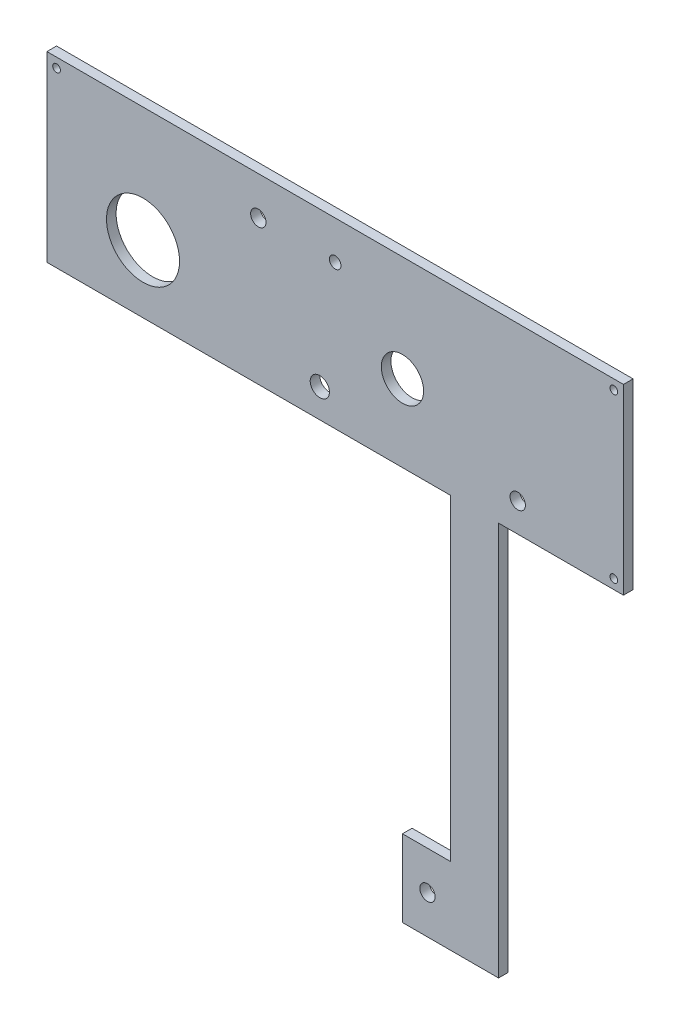
ISO-10303-21;
HEADER;
FILE_DESCRIPTION(('STEP AP214'),'2;1');
FILE_NAME('part.step','',(''),(''),'','','');
FILE_SCHEMA(('AUTOMOTIVE_DESIGN { 1 0 10303 214 1 1 1 1 }'));
ENDSEC;
DATA;
#1=APPLICATION_CONTEXT('core data for automotive mechanical design processes');
#2=APPLICATION_PROTOCOL_DEFINITION('international standard','automotive_design',2000,#1);
#3=PRODUCT_CONTEXT('',#1,'mechanical');
#4=PRODUCT('Part','Part','',(#3));
#5=PRODUCT_RELATED_PRODUCT_CATEGORY('part','',(#4));
#6=PRODUCT_DEFINITION_FORMATION('','',#4);
#7=PRODUCT_DEFINITION_CONTEXT('part definition',#1,'design');
#8=PRODUCT_DEFINITION('design','',#6,#7);
#9=PRODUCT_DEFINITION_SHAPE('','',#8);
#10=(LENGTH_UNIT() NAMED_UNIT(*) SI_UNIT(.MILLI.,.METRE.));
#11=(NAMED_UNIT(*) PLANE_ANGLE_UNIT() SI_UNIT($,.RADIAN.));
#12=(NAMED_UNIT(*) SI_UNIT($,.STERADIAN.) SOLID_ANGLE_UNIT());
#13=UNCERTAINTY_MEASURE_WITH_UNIT(LENGTH_MEASURE(1.E-05),#10,'distance_accuracy_value','');
#14=(GEOMETRIC_REPRESENTATION_CONTEXT(3) GLOBAL_UNCERTAINTY_ASSIGNED_CONTEXT((#13)) GLOBAL_UNIT_ASSIGNED_CONTEXT((#10,
#11,#12)) REPRESENTATION_CONTEXT('',''));
#15=CARTESIAN_POINT('',(0.,0.,0.));
#16=DIRECTION('',(0.,0.,1.));
#17=DIRECTION('',(1.,0.,0.));
#18=AXIS2_PLACEMENT_3D('',#15,#16,#17);
#19=CARTESIAN_POINT('',(105.426271186441,-8.28728813559318,5.));
#20=DIRECTION('',(0.,0.,-1.));
#21=DIRECTION('',(-1.,0.,0.));
#22=AXIS2_PLACEMENT_3D('',#19,#20,#21);
#23=PLANE('',#22);
#24=CARTESIAN_POINT('',(165.426271186441,81.7127118644068,5.));
#25=DIRECTION('',(0.,0.,1.));
#26=DIRECTION('',(1.,0.,0.));
#27=AXIS2_PLACEMENT_3D('',#24,#25,#26);
#28=CIRCLE('',#27,2.);
#29=CARTESIAN_POINT('',(167.426271186441,81.7127118644068,5.));
#30=VERTEX_POINT('',#29);
#31=EDGE_CURVE('E252',#30,#30,#28,.T.);
#32=ORIENTED_EDGE('',*,*,#31,.F.);
#33=EDGE_LOOP('',(#32));
#34=FACE_BOUND('',#33,.T.);
#35=CARTESIAN_POINT('',(12.4262711864407,6.71271186440681,5.));
#36=DIRECTION('',(0.,0.,1.));
#37=DIRECTION('',(1.,0.,0.));
#38=AXIS2_PLACEMENT_3D('',#35,#36,#37);
#39=CIRCLE('',#38,5.);
#40=CARTESIAN_POINT('',(17.4262711864407,6.71271186440681,5.));
#41=VERTEX_POINT('',#40);
#42=EDGE_CURVE('E240',#41,#41,#39,.T.);
#43=ORIENTED_EDGE('',*,*,#42,.F.);
#44=EDGE_LOOP('',(#43));
#45=FACE_BOUND('',#44,.T.);
#46=CARTESIAN_POINT('',(55.4262711864407,31.7127118644068,5.));
#47=DIRECTION('',(0.,0.,1.));
#48=DIRECTION('',(1.,0.,0.));
#49=AXIS2_PLACEMENT_3D('',#46,#47,#48);
#50=CIRCLE('',#49,11.);
#51=CARTESIAN_POINT('',(66.4262711864407,31.7127118644068,5.));
#52=VERTEX_POINT('',#51);
#53=EDGE_CURVE('E228',#52,#52,#50,.T.);
#54=ORIENTED_EDGE('',*,*,#53,.F.);
#55=EDGE_LOOP('',(#54));
#56=FACE_BOUND('',#55,.T.);
#57=CARTESIAN_POINT('',(-124.573728813559,81.7127118644068,5.));
#58=DIRECTION('',(0.,0.,1.));
#59=DIRECTION('',(1.,0.,0.));
#60=AXIS2_PLACEMENT_3D('',#57,#58,#59);
#61=CIRCLE('',#60,2.);
#62=CARTESIAN_POINT('',(-122.573728813559,81.7127118644068,5.));
#63=VERTEX_POINT('',#62);
#64=EDGE_CURVE('E216',#63,#63,#61,.T.);
#65=ORIENTED_EDGE('',*,*,#64,.F.);
#66=EDGE_LOOP('',(#65));
#67=FACE_BOUND('',#66,.T.);
#68=CARTESIAN_POINT('',(68.4262711864407,-193.287288135593,5.));
#69=DIRECTION('',(0.,0.,1.));
#70=DIRECTION('',(1.,0.,0.));
#71=AXIS2_PLACEMENT_3D('',#68,#69,#70);
#72=CIRCLE('',#71,4.00000000000001);
#73=CARTESIAN_POINT('',(72.4262711864408,-193.287288135593,5.));
#74=VERTEX_POINT('',#73);
#75=EDGE_CURVE('E144',#74,#74,#72,.T.);
#76=ORIENTED_EDGE('',*,*,#75,.F.);
#77=EDGE_LOOP('',(#76));
#78=FACE_BOUND('',#77,.T.);
#79=DIRECTION('',(0.,1.,0.));
#80=VECTOR('',#79,1.);
#81=CARTESIAN_POINT('',(105.426271186441,-8.28728813559321,5.));
#82=LINE('',#81,#80);
#83=CARTESIAN_POINT('',(105.426271186441,-213.287288135593,5.));
#84=VERTEX_POINT('',#83);
#85=CARTESIAN_POINT('',(105.426271186441,-8.28728813559321,5.));
#86=VERTEX_POINT('',#85);
#87=EDGE_CURVE('E159',#84,#86,#82,.T.);
#88=ORIENTED_EDGE('',*,*,#87,.T.);
#89=DIRECTION('',(1.,0.,0.));
#90=VECTOR('',#89,1.);
#91=CARTESIAN_POINT('',(170.426271186441,-8.28728813559321,5.));
#92=LINE('',#91,#90);
#93=CARTESIAN_POINT('',(170.426271186441,-8.28728813559321,5.));
#94=VERTEX_POINT('',#93);
#95=EDGE_CURVE('E97',#86,#94,#92,.T.);
#96=ORIENTED_EDGE('',*,*,#95,.T.);
#97=DIRECTION('',(0.,1.,0.));
#98=VECTOR('',#97,1.);
#99=CARTESIAN_POINT('',(170.426271186441,86.7127118644068,5.));
#100=LINE('',#99,#98);
#101=CARTESIAN_POINT('',(170.426271186441,86.7127118644068,5.));
#102=VERTEX_POINT('',#101);
#103=EDGE_CURVE('E180',#94,#102,#100,.T.);
#104=ORIENTED_EDGE('',*,*,#103,.T.);
#105=DIRECTION('',(-1.,0.,0.));
#106=VECTOR('',#105,1.);
#107=CARTESIAN_POINT('',(-129.573728813559,86.7127118644068,5.));
#108=LINE('',#107,#106);
#109=CARTESIAN_POINT('',(-129.573728813559,86.7127118644068,5.));
#110=VERTEX_POINT('',#109);
#111=EDGE_CURVE('E199',#102,#110,#108,.T.);
#112=ORIENTED_EDGE('',*,*,#111,.T.);
#113=DIRECTION('',(0.,-1.,0.));
#114=VECTOR('',#113,1.);
#115=CARTESIAN_POINT('',(-129.573728813559,-8.28728813559321,5.));
#116=LINE('',#115,#114);
#117=CARTESIAN_POINT('',(-129.573728813559,-8.28728813559321,5.));
#118=VERTEX_POINT('',#117);
#119=EDGE_CURVE('E196',#110,#118,#116,.T.);
#120=ORIENTED_EDGE('',*,*,#119,.T.);
#121=DIRECTION('',(1.,0.,0.));
#122=VECTOR('',#121,1.);
#123=CARTESIAN_POINT('',(80.4262711864408,-8.28728813559318,5.));
#124=LINE('',#123,#122);
#125=CARTESIAN_POINT('',(80.4262711864408,-8.28728813559318,5.));
#126=VERTEX_POINT('',#125);
#127=EDGE_CURVE('E198',#118,#126,#124,.T.);
#128=ORIENTED_EDGE('',*,*,#127,.T.);
#129=DIRECTION('',(0.,-1.,0.));
#130=VECTOR('',#129,1.);
#131=CARTESIAN_POINT('',(80.4262711864408,-173.287288135593,5.));
#132=LINE('',#131,#130);
#133=CARTESIAN_POINT('',(80.4262711864408,-173.287288135593,5.));
#134=VERTEX_POINT('',#133);
#135=EDGE_CURVE('E122',#126,#134,#132,.T.);
#136=ORIENTED_EDGE('',*,*,#135,.T.);
#137=DIRECTION('',(-1.,0.,0.));
#138=VECTOR('',#137,1.);
#139=CARTESIAN_POINT('',(55.4262711864408,-173.287288135593,5.));
#140=LINE('',#139,#138);
#141=CARTESIAN_POINT('',(55.4262711864408,-173.287288135593,5.));
#142=VERTEX_POINT('',#141);
#143=EDGE_CURVE('E116',#134,#142,#140,.T.);
#144=ORIENTED_EDGE('',*,*,#143,.T.);
#145=DIRECTION('',(0.,-1.,0.));
#146=VECTOR('',#145,1.);
#147=CARTESIAN_POINT('',(55.4262711864408,-213.287288135593,5.));
#148=LINE('',#147,#146);
#149=CARTESIAN_POINT('',(55.4262711864408,-213.287288135593,5.));
#150=VERTEX_POINT('',#149);
#151=EDGE_CURVE('E120',#142,#150,#148,.T.);
#152=ORIENTED_EDGE('',*,*,#151,.T.);
#153=DIRECTION('',(1.,0.,0.));
#154=VECTOR('',#153,1.);
#155=CARTESIAN_POINT('',(105.426271186441,-213.287288135593,5.));
#156=LINE('',#155,#154);
#157=EDGE_CURVE('E48',#150,#84,#156,.T.);
#158=ORIENTED_EDGE('',*,*,#157,.T.);
#159=EDGE_LOOP('',(#88,#96,#104,#112,#120,#128,#136,#144,#152,#158));
#160=FACE_BOUND('',#159,.T.);
#161=CARTESIAN_POINT('',(20.4262711864407,66.7127118644068,5.));
#162=DIRECTION('',(0.,0.,1.));
#163=DIRECTION('',(1.,0.,0.));
#164=AXIS2_PLACEMENT_3D('',#161,#162,#163);
#165=CIRCLE('',#164,3.);
#166=CARTESIAN_POINT('',(23.4262711864407,66.7127118644068,5.));
#167=VERTEX_POINT('',#166);
#168=EDGE_CURVE('E210',#167,#167,#165,.T.);
#169=ORIENTED_EDGE('',*,*,#168,.F.);
#170=EDGE_LOOP('',(#169));
#171=FACE_BOUND('',#170,.T.);
#172=CARTESIAN_POINT('',(115.426271186441,6.71271186440679,5.));
#173=DIRECTION('',(0.,0.,1.));
#174=DIRECTION('',(1.,0.,0.));
#175=AXIS2_PLACEMENT_3D('',#172,#173,#174);
#176=CIRCLE('',#175,4.00000000000001);
#177=CARTESIAN_POINT('',(119.426271186441,6.71271186440679,5.));
#178=VERTEX_POINT('',#177);
#179=EDGE_CURVE('E222',#178,#178,#176,.T.);
#180=ORIENTED_EDGE('',*,*,#179,.F.);
#181=EDGE_LOOP('',(#180));
#182=FACE_BOUND('',#181,.T.);
#183=CARTESIAN_POINT('',(-79.5737288135593,26.7127118644068,5.));
#184=DIRECTION('',(0.,0.,1.));
#185=DIRECTION('',(1.,0.,0.));
#186=AXIS2_PLACEMENT_3D('',#183,#184,#185);
#187=CIRCLE('',#186,19.);
#188=CARTESIAN_POINT('',(-60.5737288135593,26.7127118644068,5.));
#189=VERTEX_POINT('',#188);
#190=EDGE_CURVE('E234',#189,#189,#187,.T.);
#191=ORIENTED_EDGE('',*,*,#190,.F.);
#192=EDGE_LOOP('',(#191));
#193=FACE_BOUND('',#192,.T.);
#194=CARTESIAN_POINT('',(-19.5737288135593,66.7127118644068,5.));
#195=DIRECTION('',(0.,0.,1.));
#196=DIRECTION('',(1.,0.,0.));
#197=AXIS2_PLACEMENT_3D('',#194,#195,#196);
#198=CIRCLE('',#197,4.);
#199=CARTESIAN_POINT('',(-15.5737288135593,66.7127118644068,5.));
#200=VERTEX_POINT('',#199);
#201=EDGE_CURVE('E246',#200,#200,#198,.T.);
#202=ORIENTED_EDGE('',*,*,#201,.F.);
#203=EDGE_LOOP('',(#202));
#204=FACE_BOUND('',#203,.T.);
#205=CARTESIAN_POINT('',(165.426271186441,-3.28728813559321,5.));
#206=DIRECTION('',(0.,0.,1.));
#207=DIRECTION('',(1.,0.,0.));
#208=AXIS2_PLACEMENT_3D('',#205,#206,#207);
#209=CIRCLE('',#208,2.);
#210=CARTESIAN_POINT('',(167.426271186441,-3.28728813559321,5.));
#211=VERTEX_POINT('',#210);
#212=EDGE_CURVE('E258',#211,#211,#209,.T.);
#213=ORIENTED_EDGE('',*,*,#212,.F.);
#214=EDGE_LOOP('',(#213));
#215=FACE_BOUND('',#214,.T.);
#216=ADVANCED_FACE('F31',(#34,#45,#56,#67,#78,#160,#171,#182,#193,#204,#215),#23,.F.);
#217=CARTESIAN_POINT('',(105.426271186441,-8.28728813559318,0.));
#218=DIRECTION('',(0.,0.,-1.));
#219=DIRECTION('',(-1.,0.,0.));
#220=AXIS2_PLACEMENT_3D('',#217,#218,#219);
#221=PLANE('',#220);
#222=CARTESIAN_POINT('',(165.426271186441,81.7127118644068,0.));
#223=DIRECTION('',(0.,0.,1.));
#224=DIRECTION('',(1.,0.,0.));
#225=AXIS2_PLACEMENT_3D('',#222,#223,#224);
#226=CIRCLE('',#225,2.);
#227=CARTESIAN_POINT('',(167.426271186441,81.7127118644068,0.));
#228=VERTEX_POINT('',#227);
#229=EDGE_CURVE('E255',#228,#228,#226,.T.);
#230=ORIENTED_EDGE('',*,*,#229,.T.);
#231=EDGE_LOOP('',(#230));
#232=FACE_BOUND('',#231,.T.);
#233=CARTESIAN_POINT('',(12.4262711864407,6.71271186440681,0.));
#234=DIRECTION('',(0.,0.,1.));
#235=DIRECTION('',(1.,0.,0.));
#236=AXIS2_PLACEMENT_3D('',#233,#234,#235);
#237=CIRCLE('',#236,5.);
#238=CARTESIAN_POINT('',(17.4262711864407,6.71271186440681,0.));
#239=VERTEX_POINT('',#238);
#240=EDGE_CURVE('E243',#239,#239,#237,.T.);
#241=ORIENTED_EDGE('',*,*,#240,.T.);
#242=EDGE_LOOP('',(#241));
#243=FACE_BOUND('',#242,.T.);
#244=CARTESIAN_POINT('',(55.4262711864407,31.7127118644068,0.));
#245=DIRECTION('',(0.,0.,1.));
#246=DIRECTION('',(1.,0.,0.));
#247=AXIS2_PLACEMENT_3D('',#244,#245,#246);
#248=CIRCLE('',#247,11.);
#249=CARTESIAN_POINT('',(66.4262711864407,31.7127118644068,0.));
#250=VERTEX_POINT('',#249);
#251=EDGE_CURVE('E231',#250,#250,#248,.T.);
#252=ORIENTED_EDGE('',*,*,#251,.T.);
#253=EDGE_LOOP('',(#252));
#254=FACE_BOUND('',#253,.T.);
#255=CARTESIAN_POINT('',(-124.573728813559,81.7127118644068,0.));
#256=DIRECTION('',(0.,0.,1.));
#257=DIRECTION('',(1.,0.,0.));
#258=AXIS2_PLACEMENT_3D('',#255,#256,#257);
#259=CIRCLE('',#258,2.);
#260=CARTESIAN_POINT('',(-122.573728813559,81.7127118644068,0.));
#261=VERTEX_POINT('',#260);
#262=EDGE_CURVE('E219',#261,#261,#259,.T.);
#263=ORIENTED_EDGE('',*,*,#262,.T.);
#264=EDGE_LOOP('',(#263));
#265=FACE_BOUND('',#264,.T.);
#266=CARTESIAN_POINT('',(68.4262711864407,-193.287288135593,0.));
#267=DIRECTION('',(0.,0.,1.));
#268=DIRECTION('',(1.,0.,0.));
#269=AXIS2_PLACEMENT_3D('',#266,#267,#268);
#270=CIRCLE('',#269,4.00000000000001);
#271=CARTESIAN_POINT('',(72.4262711864408,-193.287288135593,0.));
#272=VERTEX_POINT('',#271);
#273=EDGE_CURVE('E207',#272,#272,#270,.T.);
#274=ORIENTED_EDGE('',*,*,#273,.T.);
#275=EDGE_LOOP('',(#274));
#276=FACE_BOUND('',#275,.T.);
#277=DIRECTION('',(0.,1.,0.));
#278=VECTOR('',#277,1.);
#279=CARTESIAN_POINT('',(105.426271186441,-8.28728813559321,0.));
#280=LINE('',#279,#278);
#281=CARTESIAN_POINT('',(105.426271186441,-213.287288135593,0.));
#282=VERTEX_POINT('',#281);
#283=CARTESIAN_POINT('',(105.426271186441,-8.28728813559321,0.));
#284=VERTEX_POINT('',#283);
#285=EDGE_CURVE('E140',#282,#284,#280,.T.);
#286=ORIENTED_EDGE('',*,*,#285,.F.);
#287=DIRECTION('',(1.,0.,0.));
#288=VECTOR('',#287,1.);
#289=CARTESIAN_POINT('',(105.426271186441,-213.287288135593,0.));
#290=LINE('',#289,#288);
#291=CARTESIAN_POINT('',(55.4262711864408,-213.287288135593,0.));
#292=VERTEX_POINT('',#291);
#293=EDGE_CURVE('E89',#292,#282,#290,.T.);
#294=ORIENTED_EDGE('',*,*,#293,.F.);
#295=DIRECTION('',(0.,-1.,0.));
#296=VECTOR('',#295,1.);
#297=CARTESIAN_POINT('',(55.4262711864408,-213.287288135593,0.));
#298=LINE('',#297,#296);
#299=CARTESIAN_POINT('',(55.4262711864408,-173.287288135593,0.));
#300=VERTEX_POINT('',#299);
#301=EDGE_CURVE('E83',#300,#292,#298,.T.);
#302=ORIENTED_EDGE('',*,*,#301,.F.);
#303=DIRECTION('',(-1.,0.,0.));
#304=VECTOR('',#303,1.);
#305=CARTESIAN_POINT('',(55.4262711864408,-173.287288135593,0.));
#306=LINE('',#305,#304);
#307=CARTESIAN_POINT('',(80.4262711864408,-173.287288135593,0.));
#308=VERTEX_POINT('',#307);
#309=EDGE_CURVE('E130',#308,#300,#306,.T.);
#310=ORIENTED_EDGE('',*,*,#309,.F.);
#311=DIRECTION('',(0.,-1.,0.));
#312=VECTOR('',#311,1.);
#313=CARTESIAN_POINT('',(80.4262711864408,-173.287288135593,0.));
#314=LINE('',#313,#312);
#315=CARTESIAN_POINT('',(80.4262711864408,-8.28728813559318,0.));
#316=VERTEX_POINT('',#315);
#317=EDGE_CURVE('E154',#316,#308,#314,.T.);
#318=ORIENTED_EDGE('',*,*,#317,.F.);
#319=DIRECTION('',(1.,0.,0.));
#320=VECTOR('',#319,1.);
#321=CARTESIAN_POINT('',(80.4262711864408,-8.28728813559318,0.));
#322=LINE('',#321,#320);
#323=CARTESIAN_POINT('',(-129.573728813559,-8.28728813559321,0.));
#324=VERTEX_POINT('',#323);
#325=EDGE_CURVE('E152',#324,#316,#322,.T.);
#326=ORIENTED_EDGE('',*,*,#325,.F.);
#327=DIRECTION('',(0.,-1.,0.));
#328=VECTOR('',#327,1.);
#329=CARTESIAN_POINT('',(-129.573728813559,-8.28728813559321,0.));
#330=LINE('',#329,#328);
#331=CARTESIAN_POINT('',(-129.573728813559,86.7127118644068,0.));
#332=VERTEX_POINT('',#331);
#333=EDGE_CURVE('E150',#332,#324,#330,.T.);
#334=ORIENTED_EDGE('',*,*,#333,.F.);
#335=DIRECTION('',(-1.,0.,0.));
#336=VECTOR('',#335,1.);
#337=CARTESIAN_POINT('',(-129.573728813559,86.7127118644068,0.));
#338=LINE('',#337,#336);
#339=CARTESIAN_POINT('',(170.426271186441,86.7127118644068,0.));
#340=VERTEX_POINT('',#339);
#341=EDGE_CURVE('E148',#340,#332,#338,.T.);
#342=ORIENTED_EDGE('',*,*,#341,.F.);
#343=DIRECTION('',(0.,1.,0.));
#344=VECTOR('',#343,1.);
#345=CARTESIAN_POINT('',(170.426271186441,86.7127118644068,0.));
#346=LINE('',#345,#344);
#347=CARTESIAN_POINT('',(170.426271186441,-8.28728813559321,0.));
#348=VERTEX_POINT('',#347);
#349=EDGE_CURVE('E146',#348,#340,#346,.T.);
#350=ORIENTED_EDGE('',*,*,#349,.F.);
#351=DIRECTION('',(1.,0.,0.));
#352=VECTOR('',#351,1.);
#353=CARTESIAN_POINT('',(170.426271186441,-8.28728813559321,0.));
#354=LINE('',#353,#352);
#355=EDGE_CURVE('E143',#284,#348,#354,.T.);
#356=ORIENTED_EDGE('',*,*,#355,.F.);
#357=EDGE_LOOP('',(#286,#294,#302,#310,#318,#326,#334,#342,#350,#356));
#358=FACE_BOUND('',#357,.T.);
#359=CARTESIAN_POINT('',(20.4262711864407,66.7127118644068,0.));
#360=DIRECTION('',(0.,0.,1.));
#361=DIRECTION('',(1.,0.,0.));
#362=AXIS2_PLACEMENT_3D('',#359,#360,#361);
#363=CIRCLE('',#362,3.);
#364=CARTESIAN_POINT('',(23.4262711864407,66.7127118644068,0.));
#365=VERTEX_POINT('',#364);
#366=EDGE_CURVE('E213',#365,#365,#363,.T.);
#367=ORIENTED_EDGE('',*,*,#366,.T.);
#368=EDGE_LOOP('',(#367));
#369=FACE_BOUND('',#368,.T.);
#370=CARTESIAN_POINT('',(115.426271186441,6.71271186440679,0.));
#371=DIRECTION('',(0.,0.,1.));
#372=DIRECTION('',(1.,0.,0.));
#373=AXIS2_PLACEMENT_3D('',#370,#371,#372);
#374=CIRCLE('',#373,4.00000000000001);
#375=CARTESIAN_POINT('',(119.426271186441,6.71271186440679,0.));
#376=VERTEX_POINT('',#375);
#377=EDGE_CURVE('E225',#376,#376,#374,.T.);
#378=ORIENTED_EDGE('',*,*,#377,.T.);
#379=EDGE_LOOP('',(#378));
#380=FACE_BOUND('',#379,.T.);
#381=CARTESIAN_POINT('',(-79.5737288135593,26.7127118644068,0.));
#382=DIRECTION('',(0.,0.,1.));
#383=DIRECTION('',(1.,0.,0.));
#384=AXIS2_PLACEMENT_3D('',#381,#382,#383);
#385=CIRCLE('',#384,19.);
#386=CARTESIAN_POINT('',(-60.5737288135593,26.7127118644068,0.));
#387=VERTEX_POINT('',#386);
#388=EDGE_CURVE('E237',#387,#387,#385,.T.);
#389=ORIENTED_EDGE('',*,*,#388,.T.);
#390=EDGE_LOOP('',(#389));
#391=FACE_BOUND('',#390,.T.);
#392=CARTESIAN_POINT('',(-19.5737288135593,66.7127118644068,0.));
#393=DIRECTION('',(0.,0.,1.));
#394=DIRECTION('',(1.,0.,0.));
#395=AXIS2_PLACEMENT_3D('',#392,#393,#394);
#396=CIRCLE('',#395,4.);
#397=CARTESIAN_POINT('',(-15.5737288135593,66.7127118644068,0.));
#398=VERTEX_POINT('',#397);
#399=EDGE_CURVE('E249',#398,#398,#396,.T.);
#400=ORIENTED_EDGE('',*,*,#399,.T.);
#401=EDGE_LOOP('',(#400));
#402=FACE_BOUND('',#401,.T.);
#403=CARTESIAN_POINT('',(165.426271186441,-3.28728813559321,0.));
#404=DIRECTION('',(0.,0.,1.));
#405=DIRECTION('',(1.,0.,0.));
#406=AXIS2_PLACEMENT_3D('',#403,#404,#405);
#407=CIRCLE('',#406,2.);
#408=CARTESIAN_POINT('',(167.426271186441,-3.28728813559321,0.));
#409=VERTEX_POINT('',#408);
#410=EDGE_CURVE('E261',#409,#409,#407,.T.);
#411=ORIENTED_EDGE('',*,*,#410,.T.);
#412=EDGE_LOOP('',(#411));
#413=FACE_BOUND('',#412,.T.);
#414=ADVANCED_FACE('F184',(#232,#243,#254,#265,#276,#358,#369,#380,#391,#402,#413),#221,.T.);
#415=CARTESIAN_POINT('',(105.426271186441,-8.28728813559321,5.));
#416=DIRECTION('',(-1.,0.,0.));
#417=DIRECTION('',(0.,-1.,0.));
#418=AXIS2_PLACEMENT_3D('',#415,#416,#417);
#419=PLANE('',#418);
#420=ORIENTED_EDGE('',*,*,#285,.T.);
#421=DIRECTION('',(0.,0.,-1.));
#422=VECTOR('',#421,1.);
#423=CARTESIAN_POINT('',(105.426271186441,-8.28728813559321,5.));
#424=LINE('',#423,#422);
#425=EDGE_CURVE('E11',#86,#284,#424,.T.);
#426=ORIENTED_EDGE('',*,*,#425,.F.);
#427=ORIENTED_EDGE('',*,*,#87,.F.);
#428=DIRECTION('',(0.,0.,-1.));
#429=VECTOR('',#428,1.);
#430=CARTESIAN_POINT('',(105.426271186441,-213.287288135593,5.));
#431=LINE('',#430,#429);
#432=EDGE_CURVE('E136',#84,#282,#431,.T.);
#433=ORIENTED_EDGE('',*,*,#432,.T.);
#434=EDGE_LOOP('',(#420,#426,#427,#433));
#435=FACE_BOUND('',#434,.T.);
#436=ADVANCED_FACE('F33',(#435),#419,.F.);
#437=CARTESIAN_POINT('',(170.426271186441,-8.28728813559321,5.));
#438=DIRECTION('',(0.,1.,0.));
#439=DIRECTION('',(-1.,0.,0.));
#440=AXIS2_PLACEMENT_3D('',#437,#438,#439);
#441=PLANE('',#440);
#442=ORIENTED_EDGE('',*,*,#355,.T.);
#443=DIRECTION('',(0.,0.,-1.));
#444=VECTOR('',#443,1.);
#445=CARTESIAN_POINT('',(170.426271186441,-8.28728813559321,5.));
#446=LINE('',#445,#444);
#447=EDGE_CURVE('E40',#94,#348,#446,.T.);
#448=ORIENTED_EDGE('',*,*,#447,.F.);
#449=ORIENTED_EDGE('',*,*,#95,.F.);
#450=ORIENTED_EDGE('',*,*,#425,.T.);
#451=EDGE_LOOP('',(#442,#448,#449,#450));
#452=FACE_BOUND('',#451,.T.);
#453=ADVANCED_FACE('F304',(#452),#441,.F.);
#454=CARTESIAN_POINT('',(170.426271186441,86.7127118644068,5.));
#455=DIRECTION('',(-1.,0.,0.));
#456=DIRECTION('',(0.,-1.,0.));
#457=AXIS2_PLACEMENT_3D('',#454,#455,#456);
#458=PLANE('',#457);
#459=ORIENTED_EDGE('',*,*,#349,.T.);
#460=DIRECTION('',(0.,0.,-1.));
#461=VECTOR('',#460,1.);
#462=CARTESIAN_POINT('',(170.426271186441,86.7127118644068,5.));
#463=LINE('',#462,#461);
#464=EDGE_CURVE('E172',#102,#340,#463,.T.);
#465=ORIENTED_EDGE('',*,*,#464,.F.);
#466=ORIENTED_EDGE('',*,*,#103,.F.);
#467=ORIENTED_EDGE('',*,*,#447,.T.);
#468=EDGE_LOOP('',(#459,#465,#466,#467));
#469=FACE_BOUND('',#468,.T.);
#470=ADVANCED_FACE('F178',(#469),#458,.F.);
#471=CARTESIAN_POINT('',(-129.573728813559,86.7127118644068,5.));
#472=DIRECTION('',(0.,-1.,0.));
#473=DIRECTION('',(0.,0.,-1.));
#474=AXIS2_PLACEMENT_3D('',#471,#472,#473);
#475=PLANE('',#474);
#476=ORIENTED_EDGE('',*,*,#341,.T.);
#477=DIRECTION('',(0.,0.,-1.));
#478=VECTOR('',#477,1.);
#479=CARTESIAN_POINT('',(-129.573728813559,86.7127118644068,5.));
#480=LINE('',#479,#478);
#481=EDGE_CURVE('E169',#110,#332,#480,.T.);
#482=ORIENTED_EDGE('',*,*,#481,.F.);
#483=ORIENTED_EDGE('',*,*,#111,.F.);
#484=ORIENTED_EDGE('',*,*,#464,.T.);
#485=EDGE_LOOP('',(#476,#482,#483,#484));
#486=FACE_BOUND('',#485,.T.);
#487=ADVANCED_FACE('F190',(#486),#475,.F.);
#488=CARTESIAN_POINT('',(-129.573728813559,-8.28728813559321,5.));
#489=DIRECTION('',(1.,0.,0.));
#490=DIRECTION('',(0.,0.,-1.));
#491=AXIS2_PLACEMENT_3D('',#488,#489,#490);
#492=PLANE('',#491);
#493=ORIENTED_EDGE('',*,*,#333,.T.);
#494=DIRECTION('',(0.,0.,-1.));
#495=VECTOR('',#494,1.);
#496=CARTESIAN_POINT('',(-129.573728813559,-8.28728813559321,5.));
#497=LINE('',#496,#495);
#498=EDGE_CURVE('E166',#118,#324,#497,.T.);
#499=ORIENTED_EDGE('',*,*,#498,.F.);
#500=ORIENTED_EDGE('',*,*,#119,.F.);
#501=ORIENTED_EDGE('',*,*,#481,.T.);
#502=EDGE_LOOP('',(#493,#499,#500,#501));
#503=FACE_BOUND('',#502,.T.);
#504=ADVANCED_FACE('F194',(#503),#492,.F.);
#505=CARTESIAN_POINT('',(80.4262711864408,-8.28728813559318,5.));
#506=DIRECTION('',(0.,1.,0.));
#507=DIRECTION('',(-1.,0.,0.));
#508=AXIS2_PLACEMENT_3D('',#505,#506,#507);
#509=PLANE('',#508);
#510=ORIENTED_EDGE('',*,*,#325,.T.);
#511=DIRECTION('',(0.,0.,-1.));
#512=VECTOR('',#511,1.);
#513=CARTESIAN_POINT('',(80.4262711864408,-8.28728813559318,5.));
#514=LINE('',#513,#512);
#515=EDGE_CURVE('E163',#126,#316,#514,.T.);
#516=ORIENTED_EDGE('',*,*,#515,.F.);
#517=ORIENTED_EDGE('',*,*,#127,.F.);
#518=ORIENTED_EDGE('',*,*,#498,.T.);
#519=EDGE_LOOP('',(#510,#516,#517,#518));
#520=FACE_BOUND('',#519,.T.);
#521=ADVANCED_FACE('F294',(#520),#509,.F.);
#522=CARTESIAN_POINT('',(80.4262711864408,-173.287288135593,5.));
#523=DIRECTION('',(1.,0.,0.));
#524=DIRECTION('',(0.,0.,-1.));
#525=AXIS2_PLACEMENT_3D('',#522,#523,#524);
#526=PLANE('',#525);
#527=ORIENTED_EDGE('',*,*,#317,.T.);
#528=DIRECTION('',(0.,0.,-1.));
#529=VECTOR('',#528,1.);
#530=CARTESIAN_POINT('',(80.4262711864408,-173.287288135593,5.));
#531=LINE('',#530,#529);
#532=EDGE_CURVE('E131',#134,#308,#531,.T.);
#533=ORIENTED_EDGE('',*,*,#532,.F.);
#534=ORIENTED_EDGE('',*,*,#135,.F.);
#535=ORIENTED_EDGE('',*,*,#515,.T.);
#536=EDGE_LOOP('',(#527,#533,#534,#535));
#537=FACE_BOUND('',#536,.T.);
#538=ADVANCED_FACE('F291',(#537),#526,.F.);
#539=CARTESIAN_POINT('',(55.4262711864408,-173.287288135593,5.));
#540=DIRECTION('',(0.,-1.,0.));
#541=DIRECTION('',(0.,0.,-1.));
#542=AXIS2_PLACEMENT_3D('',#539,#540,#541);
#543=PLANE('',#542);
#544=ORIENTED_EDGE('',*,*,#309,.T.);
#545=DIRECTION('',(0.,0.,-1.));
#546=VECTOR('',#545,1.);
#547=CARTESIAN_POINT('',(55.4262711864408,-173.287288135593,5.));
#548=LINE('',#547,#546);
#549=EDGE_CURVE('E127',#142,#300,#548,.T.);
#550=ORIENTED_EDGE('',*,*,#549,.F.);
#551=ORIENTED_EDGE('',*,*,#143,.F.);
#552=ORIENTED_EDGE('',*,*,#532,.T.);
#553=EDGE_LOOP('',(#544,#550,#551,#552));
#554=FACE_BOUND('',#553,.T.);
#555=ADVANCED_FACE('F128',(#554),#543,.F.);
#556=CARTESIAN_POINT('',(55.4262711864408,-213.287288135593,5.));
#557=DIRECTION('',(1.,0.,0.));
#558=DIRECTION('',(0.,1.,0.));
#559=AXIS2_PLACEMENT_3D('',#556,#557,#558);
#560=PLANE('',#559);
#561=ORIENTED_EDGE('',*,*,#301,.T.);
#562=DIRECTION('',(0.,0.,-1.));
#563=VECTOR('',#562,1.);
#564=CARTESIAN_POINT('',(55.4262711864408,-213.287288135593,5.));
#565=LINE('',#564,#563);
#566=EDGE_CURVE('E132',#150,#292,#565,.T.);
#567=ORIENTED_EDGE('',*,*,#566,.F.);
#568=ORIENTED_EDGE('',*,*,#151,.F.);
#569=ORIENTED_EDGE('',*,*,#549,.T.);
#570=EDGE_LOOP('',(#561,#567,#568,#569));
#571=FACE_BOUND('',#570,.T.);
#572=ADVANCED_FACE('F134',(#571),#560,.F.);
#573=CARTESIAN_POINT('',(105.426271186441,-213.287288135593,5.));
#574=DIRECTION('',(0.,1.,0.));
#575=DIRECTION('',(0.,0.,1.));
#576=AXIS2_PLACEMENT_3D('',#573,#574,#575);
#577=PLANE('',#576);
#578=ORIENTED_EDGE('',*,*,#293,.T.);
#579=ORIENTED_EDGE('',*,*,#432,.F.);
#580=ORIENTED_EDGE('',*,*,#157,.F.);
#581=ORIENTED_EDGE('',*,*,#566,.T.);
#582=EDGE_LOOP('',(#578,#579,#580,#581));
#583=FACE_BOUND('',#582,.T.);
#584=ADVANCED_FACE('F284',(#583),#577,.F.);
#585=CARTESIAN_POINT('',(68.4262711864407,-193.287288135593,5.));
#586=DIRECTION('',(0.,0.,-1.));
#587=DIRECTION('',(-1.,0.,0.));
#588=AXIS2_PLACEMENT_3D('',#585,#586,#587);
#589=CYLINDRICAL_SURFACE('',#588,4.00000000000001);
#590=ORIENTED_EDGE('',*,*,#75,.T.);
#591=EDGE_LOOP('',(#590));
#592=FACE_BOUND('',#591,.T.);
#593=ORIENTED_EDGE('',*,*,#273,.F.);
#594=EDGE_LOOP('',(#593));
#595=FACE_BOUND('',#594,.T.);
#596=ADVANCED_FACE('F281',(#592,#595),#589,.F.);
#597=CARTESIAN_POINT('',(20.4262711864407,66.7127118644068,5.));
#598=DIRECTION('',(0.,0.,-1.));
#599=DIRECTION('',(-1.,0.,0.));
#600=AXIS2_PLACEMENT_3D('',#597,#598,#599);
#601=CYLINDRICAL_SURFACE('',#600,3.);
#602=ORIENTED_EDGE('',*,*,#168,.T.);
#603=EDGE_LOOP('',(#602));
#604=FACE_BOUND('',#603,.T.);
#605=ORIENTED_EDGE('',*,*,#366,.F.);
#606=EDGE_LOOP('',(#605));
#607=FACE_BOUND('',#606,.T.);
#608=ADVANCED_FACE('F380',(#604,#607),#601,.F.);
#609=CARTESIAN_POINT('',(-124.573728813559,81.7127118644068,5.));
#610=DIRECTION('',(0.,0.,-1.));
#611=DIRECTION('',(-1.,0.,0.));
#612=AXIS2_PLACEMENT_3D('',#609,#610,#611);
#613=CYLINDRICAL_SURFACE('',#612,2.);
#614=ORIENTED_EDGE('',*,*,#64,.T.);
#615=EDGE_LOOP('',(#614));
#616=FACE_BOUND('',#615,.T.);
#617=ORIENTED_EDGE('',*,*,#262,.F.);
#618=EDGE_LOOP('',(#617));
#619=FACE_BOUND('',#618,.T.);
#620=ADVANCED_FACE('F388',(#616,#619),#613,.F.);
#621=CARTESIAN_POINT('',(115.426271186441,6.71271186440679,5.));
#622=DIRECTION('',(0.,0.,-1.));
#623=DIRECTION('',(-1.,0.,0.));
#624=AXIS2_PLACEMENT_3D('',#621,#622,#623);
#625=CYLINDRICAL_SURFACE('',#624,4.00000000000001);
#626=ORIENTED_EDGE('',*,*,#179,.T.);
#627=EDGE_LOOP('',(#626));
#628=FACE_BOUND('',#627,.T.);
#629=ORIENTED_EDGE('',*,*,#377,.F.);
#630=EDGE_LOOP('',(#629));
#631=FACE_BOUND('',#630,.T.);
#632=ADVANCED_FACE('F396',(#628,#631),#625,.F.);
#633=CARTESIAN_POINT('',(55.4262711864407,31.7127118644068,5.));
#634=DIRECTION('',(0.,0.,-1.));
#635=DIRECTION('',(-1.,0.,0.));
#636=AXIS2_PLACEMENT_3D('',#633,#634,#635);
#637=CYLINDRICAL_SURFACE('',#636,11.);
#638=ORIENTED_EDGE('',*,*,#53,.T.);
#639=EDGE_LOOP('',(#638));
#640=FACE_BOUND('',#639,.T.);
#641=ORIENTED_EDGE('',*,*,#251,.F.);
#642=EDGE_LOOP('',(#641));
#643=FACE_BOUND('',#642,.T.);
#644=ADVANCED_FACE('F405',(#640,#643),#637,.F.);
#645=CARTESIAN_POINT('',(-79.5737288135593,26.7127118644068,5.));
#646=DIRECTION('',(0.,0.,-1.));
#647=DIRECTION('',(-1.,0.,0.));
#648=AXIS2_PLACEMENT_3D('',#645,#646,#647);
#649=CYLINDRICAL_SURFACE('',#648,19.);
#650=ORIENTED_EDGE('',*,*,#190,.T.);
#651=EDGE_LOOP('',(#650));
#652=FACE_BOUND('',#651,.T.);
#653=ORIENTED_EDGE('',*,*,#388,.F.);
#654=EDGE_LOOP('',(#653));
#655=FACE_BOUND('',#654,.T.);
#656=ADVANCED_FACE('F414',(#652,#655),#649,.F.);
#657=CARTESIAN_POINT('',(12.4262711864407,6.71271186440681,5.));
#658=DIRECTION('',(0.,0.,-1.));
#659=DIRECTION('',(-1.,0.,0.));
#660=AXIS2_PLACEMENT_3D('',#657,#658,#659);
#661=CYLINDRICAL_SURFACE('',#660,5.);
#662=ORIENTED_EDGE('',*,*,#42,.T.);
#663=EDGE_LOOP('',(#662));
#664=FACE_BOUND('',#663,.T.);
#665=ORIENTED_EDGE('',*,*,#240,.F.);
#666=EDGE_LOOP('',(#665));
#667=FACE_BOUND('',#666,.T.);
#668=ADVANCED_FACE('F423',(#664,#667),#661,.F.);
#669=CARTESIAN_POINT('',(-19.5737288135593,66.7127118644068,5.));
#670=DIRECTION('',(0.,0.,-1.));
#671=DIRECTION('',(-1.,0.,0.));
#672=AXIS2_PLACEMENT_3D('',#669,#670,#671);
#673=CYLINDRICAL_SURFACE('',#672,4.);
#674=ORIENTED_EDGE('',*,*,#201,.T.);
#675=EDGE_LOOP('',(#674));
#676=FACE_BOUND('',#675,.T.);
#677=ORIENTED_EDGE('',*,*,#399,.F.);
#678=EDGE_LOOP('',(#677));
#679=FACE_BOUND('',#678,.T.);
#680=ADVANCED_FACE('F432',(#676,#679),#673,.F.);
#681=CARTESIAN_POINT('',(165.426271186441,81.7127118644068,5.));
#682=DIRECTION('',(0.,0.,-1.));
#683=DIRECTION('',(-1.,0.,0.));
#684=AXIS2_PLACEMENT_3D('',#681,#682,#683);
#685=CYLINDRICAL_SURFACE('',#684,2.);
#686=ORIENTED_EDGE('',*,*,#31,.T.);
#687=EDGE_LOOP('',(#686));
#688=FACE_BOUND('',#687,.T.);
#689=ORIENTED_EDGE('',*,*,#229,.F.);
#690=EDGE_LOOP('',(#689));
#691=FACE_BOUND('',#690,.T.);
#692=ADVANCED_FACE('F441',(#688,#691),#685,.F.);
#693=CARTESIAN_POINT('',(165.426271186441,-3.28728813559321,5.));
#694=DIRECTION('',(0.,0.,-1.));
#695=DIRECTION('',(-1.,0.,0.));
#696=AXIS2_PLACEMENT_3D('',#693,#694,#695);
#697=CYLINDRICAL_SURFACE('',#696,2.);
#698=ORIENTED_EDGE('',*,*,#212,.T.);
#699=EDGE_LOOP('',(#698));
#700=FACE_BOUND('',#699,.T.);
#701=ORIENTED_EDGE('',*,*,#410,.F.);
#702=EDGE_LOOP('',(#701));
#703=FACE_BOUND('',#702,.T.);
#704=ADVANCED_FACE('F267',(#700,#703),#697,.F.);
#705=CLOSED_SHELL('',(#216,#414,#436,#453,#470,#487,#504,#521,#538,#555,#572,#584,#596,#608,
#620,#632,#644,#656,#668,#680,#692,#704));
#706=MANIFOLD_SOLID_BREP('B2',#705);
#707=ADVANCED_BREP_SHAPE_REPRESENTATION('',(#18,#706),#14);
#708=SHAPE_DEFINITION_REPRESENTATION(#9,#707);
ENDSEC;
END-ISO-10303-21;
